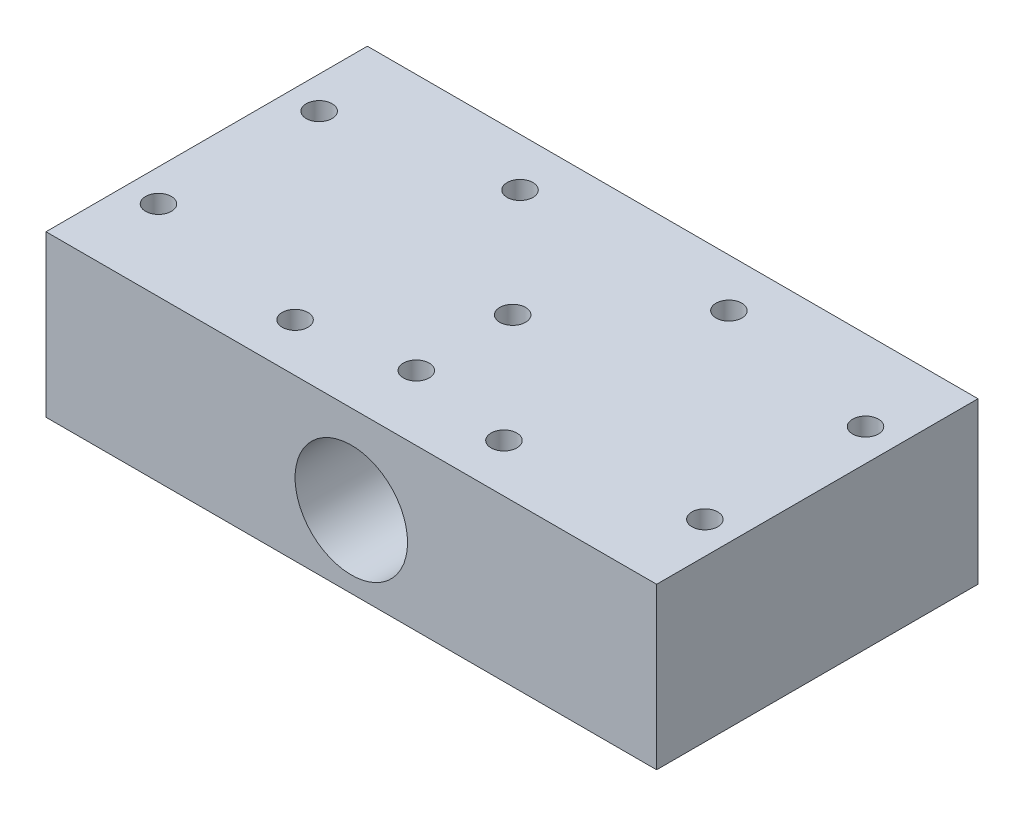
ISO-10303-21;
HEADER;
FILE_DESCRIPTION(('STEP AP214'),'2;1');
FILE_NAME('part.step','',(''),(''),'','','');
FILE_SCHEMA(('AUTOMOTIVE_DESIGN { 1 0 10303 214 1 1 1 1 }'));
ENDSEC;
DATA;
#1=APPLICATION_CONTEXT('core data for automotive mechanical design processes');
#2=APPLICATION_PROTOCOL_DEFINITION('international standard','automotive_design',2000,#1);
#3=PRODUCT_CONTEXT('',#1,'mechanical');
#4=PRODUCT('Part','Part','',(#3));
#5=PRODUCT_RELATED_PRODUCT_CATEGORY('part','',(#4));
#6=PRODUCT_DEFINITION_FORMATION('','',#4);
#7=PRODUCT_DEFINITION_CONTEXT('part definition',#1,'design');
#8=PRODUCT_DEFINITION('design','',#6,#7);
#9=PRODUCT_DEFINITION_SHAPE('','',#8);
#10=(LENGTH_UNIT() NAMED_UNIT(*) SI_UNIT(.MILLI.,.METRE.));
#11=(NAMED_UNIT(*) PLANE_ANGLE_UNIT() SI_UNIT($,.RADIAN.));
#12=(NAMED_UNIT(*) SI_UNIT($,.STERADIAN.) SOLID_ANGLE_UNIT());
#13=UNCERTAINTY_MEASURE_WITH_UNIT(LENGTH_MEASURE(1.E-05),#10,'distance_accuracy_value','');
#14=(GEOMETRIC_REPRESENTATION_CONTEXT(3) GLOBAL_UNCERTAINTY_ASSIGNED_CONTEXT((#13)) GLOBAL_UNIT_ASSIGNED_CONTEXT((#10,
#11,#12)) REPRESENTATION_CONTEXT('',''));
#15=CARTESIAN_POINT('',(0.,0.,0.));
#16=DIRECTION('',(0.,0.,1.));
#17=DIRECTION('',(1.,0.,0.));
#18=AXIS2_PLACEMENT_3D('',#15,#16,#17);
#19=CARTESIAN_POINT('',(-120.65,15.875,-31.75));
#20=DIRECTION('',(0.,0.,-1.));
#21=DIRECTION('',(-1.,0.,0.));
#22=AXIS2_PLACEMENT_3D('',#19,#20,#21);
#23=PLANE('',#22);
#24=CARTESIAN_POINT('',(-60.325,-1.58750000000001,-31.75));
#25=DIRECTION('',(0.,0.,-1.));
#26=DIRECTION('',(-1.,0.,0.));
#27=AXIS2_PLACEMENT_3D('',#24,#25,#26);
#28=CIRCLE('',#27,11.1125);
#29=CARTESIAN_POINT('',(-71.4375,-1.58750000000001,-31.75));
#30=VERTEX_POINT('',#29);
#31=EDGE_CURVE('E226',#30,#30,#28,.T.);
#32=ORIENTED_EDGE('',*,*,#31,.F.);
#33=EDGE_LOOP('',(#32));
#34=FACE_BOUND('',#33,.T.);
#35=DIRECTION('',(0.,1.,0.));
#36=VECTOR('',#35,1.);
#37=CARTESIAN_POINT('',(0.,15.875,-31.75));
#38=LINE('',#37,#36);
#39=CARTESIAN_POINT('',(0.,-15.875,-31.75));
#40=VERTEX_POINT('',#39);
#41=CARTESIAN_POINT('',(0.,15.875,-31.75));
#42=VERTEX_POINT('',#41);
#43=EDGE_CURVE('E228',#40,#42,#38,.T.);
#44=ORIENTED_EDGE('',*,*,#43,.F.);
#45=DIRECTION('',(1.,0.,0.));
#46=VECTOR('',#45,1.);
#47=CARTESIAN_POINT('',(-120.65,-15.875,-31.75));
#48=LINE('',#47,#46);
#49=CARTESIAN_POINT('',(-120.65,-15.875,-31.75));
#50=VERTEX_POINT('',#49);
#51=EDGE_CURVE('E11',#50,#40,#48,.T.);
#52=ORIENTED_EDGE('',*,*,#51,.F.);
#53=DIRECTION('',(0.,1.,0.));
#54=VECTOR('',#53,1.);
#55=CARTESIAN_POINT('',(-120.65,15.875,-31.75));
#56=LINE('',#55,#54);
#57=CARTESIAN_POINT('',(-120.65,15.875,-31.75));
#58=VERTEX_POINT('',#57);
#59=EDGE_CURVE('E237',#50,#58,#56,.T.);
#60=ORIENTED_EDGE('',*,*,#59,.T.);
#61=DIRECTION('',(1.,0.,0.));
#62=VECTOR('',#61,1.);
#63=CARTESIAN_POINT('',(-120.65,15.875,-31.75));
#64=LINE('',#63,#62);
#65=EDGE_CURVE('E40',#58,#42,#64,.T.);
#66=ORIENTED_EDGE('',*,*,#65,.T.);
#67=EDGE_LOOP('',(#44,#52,#60,#66));
#68=FACE_BOUND('',#67,.T.);
#69=ADVANCED_FACE('F37',(#34,#68),#23,.T.);
#70=CARTESIAN_POINT('',(-120.65,-15.875,31.75));
#71=DIRECTION('',(0.,-1.,0.));
#72=DIRECTION('',(0.,0.,-1.));
#73=AXIS2_PLACEMENT_3D('',#70,#71,#72);
#74=PLANE('',#73);
#75=CARTESIAN_POINT('',(-114.3,-15.875,-15.875));
#76=DIRECTION('',(0.,1.,0.));
#77=DIRECTION('',(0.,0.,1.));
#78=AXIS2_PLACEMENT_3D('',#75,#76,#77);
#79=CIRCLE('',#78,2.55269999999999);
#80=CARTESIAN_POINT('',(-114.3,-15.875,-13.3223));
#81=VERTEX_POINT('',#80);
#82=EDGE_CURVE('E131',#81,#81,#79,.T.);
#83=ORIENTED_EDGE('',*,*,#82,.T.);
#84=EDGE_LOOP('',(#83));
#85=FACE_BOUND('',#84,.T.);
#86=CARTESIAN_POINT('',(-114.3,-15.875,15.875));
#87=DIRECTION('',(0.,1.,0.));
#88=DIRECTION('',(0.,0.,1.));
#89=AXIS2_PLACEMENT_3D('',#86,#87,#88);
#90=CIRCLE('',#89,2.55269999999999);
#91=CARTESIAN_POINT('',(-114.3,-15.875,18.4277));
#92=VERTEX_POINT('',#91);
#93=EDGE_CURVE('E137',#92,#92,#90,.T.);
#94=ORIENTED_EDGE('',*,*,#93,.T.);
#95=EDGE_LOOP('',(#94));
#96=FACE_BOUND('',#95,.T.);
#97=CARTESIAN_POINT('',(-6.34999999999999,-15.875,15.875));
#98=DIRECTION('',(0.,1.,0.));
#99=DIRECTION('',(0.,0.,1.));
#100=AXIS2_PLACEMENT_3D('',#97,#98,#99);
#101=CIRCLE('',#100,2.55269999999999);
#102=CARTESIAN_POINT('',(-6.34999999999999,-15.875,18.4277));
#103=VERTEX_POINT('',#102);
#104=EDGE_CURVE('E143',#103,#103,#101,.T.);
#105=ORIENTED_EDGE('',*,*,#104,.T.);
#106=EDGE_LOOP('',(#105));
#107=FACE_BOUND('',#106,.T.);
#108=CARTESIAN_POINT('',(-6.35,-15.875,-15.875));
#109=DIRECTION('',(0.,1.,0.));
#110=DIRECTION('',(0.,0.,1.));
#111=AXIS2_PLACEMENT_3D('',#108,#109,#110);
#112=CIRCLE('',#111,2.55269999999999);
#113=CARTESIAN_POINT('',(-6.35,-15.875,-13.3223));
#114=VERTEX_POINT('',#113);
#115=EDGE_CURVE('E149',#114,#114,#112,.T.);
#116=ORIENTED_EDGE('',*,*,#115,.T.);
#117=EDGE_LOOP('',(#116));
#118=FACE_BOUND('',#117,.T.);
#119=DIRECTION('',(0.,0.,-1.));
#120=VECTOR('',#119,1.);
#121=CARTESIAN_POINT('',(0.,-15.875,31.75));
#122=LINE('',#121,#120);
#123=CARTESIAN_POINT('',(0.,-15.875,31.75));
#124=VERTEX_POINT('',#123);
#125=EDGE_CURVE('E234',#124,#40,#122,.T.);
#126=ORIENTED_EDGE('',*,*,#125,.F.);
#127=DIRECTION('',(1.,0.,0.));
#128=VECTOR('',#127,1.);
#129=CARTESIAN_POINT('',(-120.65,-15.875,31.75));
#130=LINE('',#129,#128);
#131=CARTESIAN_POINT('',(-120.65,-15.875,31.75));
#132=VERTEX_POINT('',#131);
#133=EDGE_CURVE('E46',#132,#124,#130,.T.);
#134=ORIENTED_EDGE('',*,*,#133,.F.);
#135=DIRECTION('',(0.,0.,-1.));
#136=VECTOR('',#135,1.);
#137=CARTESIAN_POINT('',(-120.65,-15.875,31.75));
#138=LINE('',#137,#136);
#139=EDGE_CURVE('E245',#132,#50,#138,.T.);
#140=ORIENTED_EDGE('',*,*,#139,.T.);
#141=ORIENTED_EDGE('',*,*,#51,.T.);
#142=EDGE_LOOP('',(#126,#134,#140,#141));
#143=FACE_BOUND('',#142,.T.);
#144=ADVANCED_FACE('F216',(#85,#96,#107,#118,#143),#74,.T.);
#145=CARTESIAN_POINT('',(-120.65,15.875,31.75));
#146=DIRECTION('',(0.,0.,1.));
#147=DIRECTION('',(0.,-1.,0.));
#148=AXIS2_PLACEMENT_3D('',#145,#146,#147);
#149=PLANE('',#148);
#150=CARTESIAN_POINT('',(-60.325,-1.58750000000001,31.75));
#151=DIRECTION('',(0.,0.,1.));
#152=DIRECTION('',(1.,0.,0.));
#153=AXIS2_PLACEMENT_3D('',#150,#151,#152);
#154=CIRCLE('',#153,11.1125);
#155=CARTESIAN_POINT('',(-49.2125,-1.58750000000001,31.75));
#156=VERTEX_POINT('',#155);
#157=EDGE_CURVE('E279',#156,#156,#154,.T.);
#158=ORIENTED_EDGE('',*,*,#157,.F.);
#159=EDGE_LOOP('',(#158));
#160=FACE_BOUND('',#159,.T.);
#161=DIRECTION('',(0.,-1.,0.));
#162=VECTOR('',#161,1.);
#163=CARTESIAN_POINT('',(0.,15.875,31.75));
#164=LINE('',#163,#162);
#165=CARTESIAN_POINT('',(0.,15.875,31.75));
#166=VERTEX_POINT('',#165);
#167=EDGE_CURVE('E236',#166,#124,#164,.T.);
#168=ORIENTED_EDGE('',*,*,#167,.F.);
#169=DIRECTION('',(1.,0.,0.));
#170=VECTOR('',#169,1.);
#171=CARTESIAN_POINT('',(-120.65,15.875,31.75));
#172=LINE('',#171,#170);
#173=CARTESIAN_POINT('',(-120.65,15.875,31.75));
#174=VERTEX_POINT('',#173);
#175=EDGE_CURVE('E244',#174,#166,#172,.T.);
#176=ORIENTED_EDGE('',*,*,#175,.F.);
#177=DIRECTION('',(0.,-1.,0.));
#178=VECTOR('',#177,1.);
#179=CARTESIAN_POINT('',(-120.65,15.875,31.75));
#180=LINE('',#179,#178);
#181=EDGE_CURVE('E246',#174,#132,#180,.T.);
#182=ORIENTED_EDGE('',*,*,#181,.T.);
#183=ORIENTED_EDGE('',*,*,#133,.T.);
#184=EDGE_LOOP('',(#168,#176,#182,#183));
#185=FACE_BOUND('',#184,.T.);
#186=ADVANCED_FACE('F221',(#160,#185),#149,.T.);
#187=CARTESIAN_POINT('',(-120.65,15.875,31.75));
#188=DIRECTION('',(0.,1.,0.));
#189=DIRECTION('',(0.,0.,1.));
#190=AXIS2_PLACEMENT_3D('',#187,#188,#189);
#191=PLANE('',#190);
#192=CARTESIAN_POINT('',(-80.9625,15.875,-22.225));
#193=DIRECTION('',(0.,1.,0.));
#194=DIRECTION('',(0.,0.,1.));
#195=AXIS2_PLACEMENT_3D('',#192,#193,#194);
#196=CIRCLE('',#195,2.55269999999999);
#197=CARTESIAN_POINT('',(-80.9625,15.875,-19.6723));
#198=VERTEX_POINT('',#197);
#199=EDGE_CURVE('E106',#198,#198,#196,.T.);
#200=ORIENTED_EDGE('',*,*,#199,.F.);
#201=EDGE_LOOP('',(#200));
#202=FACE_BOUND('',#201,.T.);
#203=CARTESIAN_POINT('',(-39.6875,15.875,22.225));
#204=DIRECTION('',(0.,1.,0.));
#205=DIRECTION('',(0.,0.,1.));
#206=AXIS2_PLACEMENT_3D('',#203,#204,#205);
#207=CIRCLE('',#206,2.55269999999999);
#208=CARTESIAN_POINT('',(-39.6875,15.875,24.7777));
#209=VERTEX_POINT('',#208);
#210=EDGE_CURVE('E105',#209,#209,#207,.T.);
#211=ORIENTED_EDGE('',*,*,#210,.F.);
#212=EDGE_LOOP('',(#211));
#213=FACE_BOUND('',#212,.T.);
#214=CARTESIAN_POINT('',(-80.9625,15.875,22.225));
#215=DIRECTION('',(0.,1.,0.));
#216=DIRECTION('',(0.,0.,1.));
#217=AXIS2_PLACEMENT_3D('',#214,#215,#216);
#218=CIRCLE('',#217,2.55269999999999);
#219=CARTESIAN_POINT('',(-80.9625,15.875,24.7777));
#220=VERTEX_POINT('',#219);
#221=EDGE_CURVE('E116',#220,#220,#218,.T.);
#222=ORIENTED_EDGE('',*,*,#221,.F.);
#223=EDGE_LOOP('',(#222));
#224=FACE_BOUND('',#223,.T.);
#225=CARTESIAN_POINT('',(-39.6875,15.875,-22.225));
#226=DIRECTION('',(0.,1.,0.));
#227=DIRECTION('',(0.,0.,1.));
#228=AXIS2_PLACEMENT_3D('',#225,#226,#227);
#229=CIRCLE('',#228,2.55269999999999);
#230=CARTESIAN_POINT('',(-39.6875,15.875,-19.6723));
#231=VERTEX_POINT('',#230);
#232=EDGE_CURVE('E122',#231,#231,#229,.T.);
#233=ORIENTED_EDGE('',*,*,#232,.F.);
#234=EDGE_LOOP('',(#233));
#235=FACE_BOUND('',#234,.T.);
#236=CARTESIAN_POINT('',(-114.3,15.875,-15.875));
#237=DIRECTION('',(0.,1.,0.));
#238=DIRECTION('',(0.,0.,1.));
#239=AXIS2_PLACEMENT_3D('',#236,#237,#238);
#240=CIRCLE('',#239,2.55269999999999);
#241=CARTESIAN_POINT('',(-114.3,15.875,-13.3223));
#242=VERTEX_POINT('',#241);
#243=EDGE_CURVE('E128',#242,#242,#240,.T.);
#244=ORIENTED_EDGE('',*,*,#243,.F.);
#245=EDGE_LOOP('',(#244));
#246=FACE_BOUND('',#245,.T.);
#247=CARTESIAN_POINT('',(-114.3,15.875,15.875));
#248=DIRECTION('',(0.,1.,0.));
#249=DIRECTION('',(0.,0.,1.));
#250=AXIS2_PLACEMENT_3D('',#247,#248,#249);
#251=CIRCLE('',#250,2.55269999999999);
#252=CARTESIAN_POINT('',(-114.3,15.875,18.4277));
#253=VERTEX_POINT('',#252);
#254=EDGE_CURVE('E134',#253,#253,#251,.T.);
#255=ORIENTED_EDGE('',*,*,#254,.F.);
#256=EDGE_LOOP('',(#255));
#257=FACE_BOUND('',#256,.T.);
#258=CARTESIAN_POINT('',(-6.34999999999999,15.875,15.875));
#259=DIRECTION('',(0.,1.,0.));
#260=DIRECTION('',(0.,0.,1.));
#261=AXIS2_PLACEMENT_3D('',#258,#259,#260);
#262=CIRCLE('',#261,2.55269999999999);
#263=CARTESIAN_POINT('',(-6.34999999999999,15.875,18.4277));
#264=VERTEX_POINT('',#263);
#265=EDGE_CURVE('E140',#264,#264,#262,.T.);
#266=ORIENTED_EDGE('',*,*,#265,.F.);
#267=EDGE_LOOP('',(#266));
#268=FACE_BOUND('',#267,.T.);
#269=CARTESIAN_POINT('',(-6.35,15.875,-15.875));
#270=DIRECTION('',(0.,1.,0.));
#271=DIRECTION('',(0.,0.,1.));
#272=AXIS2_PLACEMENT_3D('',#269,#270,#271);
#273=CIRCLE('',#272,2.55269999999999);
#274=CARTESIAN_POINT('',(-6.35,15.875,-13.3223));
#275=VERTEX_POINT('',#274);
#276=EDGE_CURVE('E146',#275,#275,#273,.T.);
#277=ORIENTED_EDGE('',*,*,#276,.F.);
#278=EDGE_LOOP('',(#277));
#279=FACE_BOUND('',#278,.T.);
#280=CARTESIAN_POINT('',(-60.325,15.875,-0.135161527175631));
#281=DIRECTION('',(0.,1.,0.));
#282=DIRECTION('',(0.,0.,1.));
#283=AXIS2_PLACEMENT_3D('',#280,#281,#282);
#284=CIRCLE('',#283,2.55269999999999);
#285=CARTESIAN_POINT('',(-60.325,15.875,2.41753847282436));
#286=VERTEX_POINT('',#285);
#287=EDGE_CURVE('E152',#286,#286,#284,.T.);
#288=ORIENTED_EDGE('',*,*,#287,.F.);
#289=EDGE_LOOP('',(#288));
#290=FACE_BOUND('',#289,.T.);
#291=CARTESIAN_POINT('',(-60.325,15.875,18.9148384728244));
#292=DIRECTION('',(0.,1.,0.));
#293=DIRECTION('',(0.,0.,1.));
#294=AXIS2_PLACEMENT_3D('',#291,#292,#293);
#295=CIRCLE('',#294,2.55269999999998);
#296=CARTESIAN_POINT('',(-60.325,15.875,21.4675384728244));
#297=VERTEX_POINT('',#296);
#298=EDGE_CURVE('E162',#297,#297,#295,.T.);
#299=ORIENTED_EDGE('',*,*,#298,.F.);
#300=EDGE_LOOP('',(#299));
#301=FACE_BOUND('',#300,.T.);
#302=DIRECTION('',(0.,0.,1.));
#303=VECTOR('',#302,1.);
#304=CARTESIAN_POINT('',(0.,15.875,31.75));
#305=LINE('',#304,#303);
#306=EDGE_CURVE('E232',#42,#166,#305,.T.);
#307=ORIENTED_EDGE('',*,*,#306,.F.);
#308=ORIENTED_EDGE('',*,*,#65,.F.);
#309=DIRECTION('',(0.,0.,1.));
#310=VECTOR('',#309,1.);
#311=CARTESIAN_POINT('',(-120.65,15.875,31.75));
#312=LINE('',#311,#310);
#313=EDGE_CURVE('E239',#58,#174,#312,.T.);
#314=ORIENTED_EDGE('',*,*,#313,.T.);
#315=ORIENTED_EDGE('',*,*,#175,.T.);
#316=EDGE_LOOP('',(#307,#308,#314,#315));
#317=FACE_BOUND('',#316,.T.);
#318=ADVANCED_FACE('F251',(#202,#213,#224,#235,#246,#257,#268,#279,#290,#301,#317),#191,.T.);
#319=CARTESIAN_POINT('',(-120.65,0.,0.));
#320=DIRECTION('',(1.,0.,0.));
#321=DIRECTION('',(0.,0.,-1.));
#322=AXIS2_PLACEMENT_3D('',#319,#320,#321);
#323=PLANE('',#322);
#324=ORIENTED_EDGE('',*,*,#59,.F.);
#325=ORIENTED_EDGE('',*,*,#139,.F.);
#326=ORIENTED_EDGE('',*,*,#181,.F.);
#327=ORIENTED_EDGE('',*,*,#313,.F.);
#328=EDGE_LOOP('',(#324,#325,#326,#327));
#329=FACE_BOUND('',#328,.T.);
#330=ADVANCED_FACE('F253',(#329),#323,.F.);
#331=CARTESIAN_POINT('',(0.,0.,0.));
#332=DIRECTION('',(1.,0.,0.));
#333=DIRECTION('',(0.,0.,-1.));
#334=AXIS2_PLACEMENT_3D('',#331,#332,#333);
#335=PLANE('',#334);
#336=ORIENTED_EDGE('',*,*,#43,.T.);
#337=ORIENTED_EDGE('',*,*,#306,.T.);
#338=ORIENTED_EDGE('',*,*,#167,.T.);
#339=ORIENTED_EDGE('',*,*,#125,.T.);
#340=EDGE_LOOP('',(#336,#337,#338,#339));
#341=FACE_BOUND('',#340,.T.);
#342=ADVANCED_FACE('F235',(#341),#335,.T.);
#343=CARTESIAN_POINT('',(-60.325,-1.58750000000001,31.75));
#344=DIRECTION('',(0.,0.,1.));
#345=DIRECTION('',(1.,0.,0.));
#346=AXIS2_PLACEMENT_3D('',#343,#344,#345);
#347=CYLINDRICAL_SURFACE('',#346,11.1125);
#348=CARTESIAN_POINT('',(-60.325,9.525,2.41753847282436));
#349=CARTESIAN_POINT('',(-60.1836030161131,9.52499743320183,2.41753390891614));
#350=CARTESIAN_POINT('',(-60.0421523668807,9.52227402163549,2.40575063493719));
#351=CARTESIAN_POINT('',(-59.7632811580994,9.51167310615282,2.35898506498536));
#352=CARTESIAN_POINT('',(-59.6258633405474,9.50379217666007,2.3239873499824));
#353=CARTESIAN_POINT('',(-59.3591272877043,9.48375209951869,2.23195657747022));
#354=CARTESIAN_POINT('',(-59.2298003401951,9.47159765034338,2.17494771314553));
#355=CARTESIAN_POINT('',(-58.9825493235107,9.44431645112713,2.04059258284332));
#356=CARTESIAN_POINT('',(-58.864625193275,9.42918971700366,1.96324642577729));
#357=CARTESIAN_POINT('',(-58.6414498665475,9.39731851811461,1.78897324868507));
#358=CARTESIAN_POINT('',(-58.5364279478591,9.38055229677803,1.69175657064048));
#359=CARTESIAN_POINT('',(-58.3440279038719,9.34744206303304,1.48112325528711));
#360=CARTESIAN_POINT('',(-58.2566514847247,9.3310980915853,1.36770505325393));
#361=CARTESIAN_POINT('',(-58.1009887590705,9.30046684205347,1.12616433399517));
#362=CARTESIAN_POINT('',(-58.032950708317,9.28620736039381,0.997877984749552));
#363=CARTESIAN_POINT('',(-57.9194898412946,9.26167366945769,0.731309994124112));
#364=CARTESIAN_POINT('',(-57.8740640192741,9.2513989305457,0.593029684000828));
#365=CARTESIAN_POINT('',(-57.8078831019162,9.23622038339159,0.312898050964632));
#366=CARTESIAN_POINT('',(-57.7867198813639,9.23122783682414,0.171148061367231));
#367=CARTESIAN_POINT('',(-57.768395113778,9.22691275314558,-0.113971575573388));
#368=CARTESIAN_POINT('',(-57.7712302998989,9.22758944429459,-0.257340999813378));
#369=CARTESIAN_POINT('',(-57.80049438228,9.23445622742297,-0.53856464284996));
#370=CARTESIAN_POINT('',(-57.8264451312256,9.24053457969065,-0.676471763653429));
#371=CARTESIAN_POINT('',(-57.900444406596,9.2573426730924,-0.945921014361591));
#372=CARTESIAN_POINT('',(-57.9484942865687,9.26807269913416,-1.07746275384803));
#373=CARTESIAN_POINT('',(-58.0657561351033,9.29308268281673,-1.33177042523305));
#374=CARTESIAN_POINT('',(-58.1351484513697,9.30739269192919,-1.45445011956088));
#375=CARTESIAN_POINT('',(-58.292998815581,9.33793234009429,-1.68659909071081));
#376=CARTESIAN_POINT('',(-58.3814597140324,9.35416226598582,-1.7960663886299));
#377=CARTESIAN_POINT('',(-58.5774489696264,9.38718949137806,-2.00143190335135));
#378=CARTESIAN_POINT('',(-58.6853829081997,9.40399107479656,-2.09694278469563));
#379=CARTESIAN_POINT('',(-58.9159305808586,9.43591604655302,-2.26857498029026));
#380=CARTESIAN_POINT('',(-59.0385446366549,9.45103939809898,-2.34469586949989));
#381=CARTESIAN_POINT('',(-59.2954715694381,9.4779612367422,-2.47549842882027));
#382=CARTESIAN_POINT('',(-59.4298133145012,9.48975119827245,-2.53012526230595));
#383=CARTESIAN_POINT('',(-59.706101531606,9.50861505852926,-2.61591879609215));
#384=CARTESIAN_POINT('',(-59.8480467771373,9.51568971541507,-2.64708926797262));
#385=CARTESIAN_POINT('',(-60.1321939374019,9.52421648014323,-2.68451243364597));
#386=CARTESIAN_POINT('',(-60.2743227607709,9.525787828652,-2.6912936601174));
#387=CARTESIAN_POINT('',(-60.5576827903625,9.52346691655541,-2.68118414882392));
#388=CARTESIAN_POINT('',(-60.6989140632958,9.51957506688891,-2.66429519151784));
#389=CARTESIAN_POINT('',(-60.9746899407241,9.50684070592155,-2.6077622498531));
#390=CARTESIAN_POINT('',(-61.1092952203391,9.4980593569585,-2.56839924002182));
#391=CARTESIAN_POINT('',(-61.3699904345264,9.47653068437118,-2.46835047943234));
#392=CARTESIAN_POINT('',(-61.4960795930954,9.46378299991955,-2.40766278865006));
#393=CARTESIAN_POINT('',(-61.7383212012406,9.43544408847207,-2.26561227302192));
#394=CARTESIAN_POINT('',(-61.8542895231755,9.41981188178931,-2.18394381398263));
#395=CARTESIAN_POINT('',(-62.071064640665,9.38751465822437,-2.00264841689266));
#396=CARTESIAN_POINT('',(-62.1718692458485,9.37084949262317,-1.90301888895941));
#397=CARTESIAN_POINT('',(-62.3575754154166,9.33794676346516,-1.68619350924275));
#398=CARTESIAN_POINT('',(-62.4421092408723,9.32172493400493,-1.56867984560511));
#399=CARTESIAN_POINT('',(-62.5902468924924,9.29193220068738,-1.32081557433808));
#400=CARTESIAN_POINT('',(-62.6538516478684,9.27836117915001,-1.19046553695365));
#401=CARTESIAN_POINT('',(-62.7578765425507,9.25554412516852,-0.921339140737835));
#402=CARTESIAN_POINT('',(-62.7984311243702,9.24627307232048,-0.78261697577913));
#403=CARTESIAN_POINT('',(-62.8555873127508,9.23306655173118,-0.500083796566928));
#404=CARTESIAN_POINT('',(-62.8721932099815,9.22913012824016,-0.35627369860384));
#405=CARTESIAN_POINT('',(-62.8807836350592,9.22710313622685,-0.0713655784080183));
#406=CARTESIAN_POINT('',(-62.8733526739332,9.2288737834957,0.0697141400236173));
#407=CARTESIAN_POINT('',(-62.8353974982893,9.23774518911233,0.348552563807455));
#408=CARTESIAN_POINT('',(-62.8048736161678,9.24484587074032,0.486311316931735));
#409=CARTESIAN_POINT('',(-62.7218943427457,9.26350625614538,0.754075312077417));
#410=CARTESIAN_POINT('',(-62.6695323331879,9.27504695790855,0.884110905932756));
#411=CARTESIAN_POINT('',(-62.544440495804,9.30129270273671,1.13363535194679));
#412=CARTESIAN_POINT('',(-62.4717082993604,9.31599811374369,1.25312297547562));
#413=CARTESIAN_POINT('',(-62.3060379612459,9.34732458660655,1.4810222298854));
#414=CARTESIAN_POINT('',(-62.2126868833472,9.36398094408373,1.58912888319103));
#415=CARTESIAN_POINT('',(-62.0092549300149,9.39710477493986,1.78833380769225));
#416=CARTESIAN_POINT('',(-61.8991701657069,9.41357220345288,1.87942811425771));
#417=CARTESIAN_POINT('',(-61.6634524909408,9.44474930683551,2.04330771367942));
#418=CARTESIAN_POINT('',(-61.5376156086198,9.45942972937864,2.1158055380505));
#419=CARTESIAN_POINT('',(-61.2752251857663,9.48508077171662,2.23850424738142));
#420=CARTESIAN_POINT('',(-61.1386803032818,9.49605435137143,2.28872293199777));
#421=CARTESIAN_POINT('',(-60.8892651012963,9.51120877334188,2.35698469518584));
#422=CARTESIAN_POINT('',(-60.7776941315176,9.51634730157453,2.37964716177968));
#423=CARTESIAN_POINT('',(-60.552426938195,9.52324385673681,2.40992548345616));
#424=CARTESIAN_POINT('',(-60.4387308287109,9.5250020645708,2.41754214374471));
#425=CARTESIAN_POINT('',(-60.325,9.525,2.41753847282436));
#426=B_SPLINE_CURVE_WITH_KNOTS('',3,(#348,#349,#350,#351,#352,#353,#354,#355,#356,#357,#358,
#359,#360,#361,#362,#363,#364,#365,#366,#367,#368,#369,#370,#371,#372,#373,#374,#375,#376,#377,
#378,#379,#380,#381,#382,#383,#384,#385,#386,#387,#388,#389,#390,#391,#392,#393,#394,#395,#396,
#397,#398,#399,#400,#401,#402,#403,#404,#405,#406,#407,#408,#409,#410,#411,#412,#413,#414,#415,
#416,#417,#418,#419,#420,#421,#422,#423,#424,#425),.UNSPECIFIED.,.T.,.F.,(4,2,2,2,2,2,2,2,2,2,2,
2,2,2,2,2,2,2,2,2,2,2,2,2,2,2,2,2,2,2,2,2,2,2,2,2,2,2,4),(0.,0.423774493378559,
0.847830739970784,1.27142221306672,1.69501141776645,2.12528317574874,2.55559651700898,
2.99120733527721,3.42676023409687,3.85487386840064,4.2829292255579,4.70233068759837,
5.12175784094858,5.54483141941706,5.96796828582672,6.40122950035739,6.83450021142713,
7.26886924458624,7.70316842003189,8.12799731890799,8.55279426409171,8.97239311136645,
9.39203014175462,9.81816596051272,10.2443632748177,10.6792840916489,11.1141855962021,
11.5465237531631,11.9787844423722,12.4006134783276,12.8224364426482,13.2424738545288,
13.6625601280783,14.0919775032117,14.521494827071,14.9572982433887,15.3927528498978,
15.7336286063474,16.0744861196662),.UNSPECIFIED.);
#427=CARTESIAN_POINT('',(-60.325,9.525,2.41753847282436));
#428=VERTEX_POINT('',#427);
#429=EDGE_CURVE('E155',#428,#428,#426,.T.);
#430=ORIENTED_EDGE('',*,*,#429,.T.);
#431=EDGE_LOOP('',(#430));
#432=FACE_BOUND('',#431,.T.);
#433=CARTESIAN_POINT('',(-60.325,9.525,21.4675384728244));
#434=CARTESIAN_POINT('',(-60.1836030161131,9.52499743320183,21.4675339089161));
#435=CARTESIAN_POINT('',(-60.0421523668807,9.52227402163549,21.4557506349372));
#436=CARTESIAN_POINT('',(-59.7632811580994,9.51167310615282,21.4089850649854));
#437=CARTESIAN_POINT('',(-59.6258633405474,9.50379217666007,21.3739873499824));
#438=CARTESIAN_POINT('',(-59.3591272877043,9.48375209951869,21.2819565774702));
#439=CARTESIAN_POINT('',(-59.2298003401951,9.47159765034338,21.2249477131455));
#440=CARTESIAN_POINT('',(-58.9825493235107,9.44431645112713,21.0905925828433));
#441=CARTESIAN_POINT('',(-58.864625193275,9.42918971700366,21.0132464257773));
#442=CARTESIAN_POINT('',(-58.6414498665475,9.39731851811461,20.8389732486851));
#443=CARTESIAN_POINT('',(-58.5364279478591,9.38055229677803,20.7417565706405));
#444=CARTESIAN_POINT('',(-58.3440279038719,9.34744206303305,20.5311232552871));
#445=CARTESIAN_POINT('',(-58.2566514847247,9.3310980915853,20.4177050532539));
#446=CARTESIAN_POINT('',(-58.1009887590705,9.30046684205347,20.1761643339952));
#447=CARTESIAN_POINT('',(-58.032950708317,9.28620736039381,20.0478779847496));
#448=CARTESIAN_POINT('',(-57.9194898412946,9.26167366945769,19.7813099941241));
#449=CARTESIAN_POINT('',(-57.8740640192741,9.2513989305457,19.6430296840008));
#450=CARTESIAN_POINT('',(-57.8078831019163,9.23622038339159,19.3628980509646));
#451=CARTESIAN_POINT('',(-57.7867198813639,9.23122783682414,19.2211480613672));
#452=CARTESIAN_POINT('',(-57.768395113778,9.22691275314559,18.9360284244266));
#453=CARTESIAN_POINT('',(-57.7712302998989,9.2275894442946,18.7926590001866));
#454=CARTESIAN_POINT('',(-57.80049438228,9.23445622742297,18.51143535715));
#455=CARTESIAN_POINT('',(-57.8264451312256,9.24053457969066,18.3735282363466));
#456=CARTESIAN_POINT('',(-57.900444406596,9.2573426730924,18.1040789856384));
#457=CARTESIAN_POINT('',(-57.9484942865687,9.26807269913416,17.972537246152));
#458=CARTESIAN_POINT('',(-58.0657561351033,9.29308268281673,17.718229574767));
#459=CARTESIAN_POINT('',(-58.1351484513697,9.30739269192919,17.5955498804391));
#460=CARTESIAN_POINT('',(-58.292998815581,9.33793234009429,17.3634009092892));
#461=CARTESIAN_POINT('',(-58.3814597140324,9.35416226598582,17.2539336113701));
#462=CARTESIAN_POINT('',(-58.5774489696264,9.38718949137806,17.0485680966487));
#463=CARTESIAN_POINT('',(-58.6853829081997,9.40399107479656,16.9530572153044));
#464=CARTESIAN_POINT('',(-58.9159305808586,9.43591604655302,16.7814250197097));
#465=CARTESIAN_POINT('',(-59.0385446366549,9.45103939809898,16.7053041305001));
#466=CARTESIAN_POINT('',(-59.2954715694381,9.4779612367422,16.5745015711797));
#467=CARTESIAN_POINT('',(-59.4298133145012,9.48975119827245,16.5198747376941));
#468=CARTESIAN_POINT('',(-59.706101531606,9.50861505852926,16.4340812039079));
#469=CARTESIAN_POINT('',(-59.8480467771373,9.51568971541507,16.4029107320274));
#470=CARTESIAN_POINT('',(-60.1321939374019,9.52421648014323,16.365487566354));
#471=CARTESIAN_POINT('',(-60.2743227607709,9.525787828652,16.3587063398826));
#472=CARTESIAN_POINT('',(-60.5576827903625,9.52346691655541,16.3688158511761));
#473=CARTESIAN_POINT('',(-60.6989140632958,9.51957506688891,16.3857048084822));
#474=CARTESIAN_POINT('',(-60.9746899407241,9.50684070592155,16.4422377501469));
#475=CARTESIAN_POINT('',(-61.1092952203391,9.4980593569585,16.4816007599782));
#476=CARTESIAN_POINT('',(-61.3699904345264,9.47653068437118,16.5816495205677));
#477=CARTESIAN_POINT('',(-61.4960795930954,9.46378299991955,16.6423372113499));
#478=CARTESIAN_POINT('',(-61.7383212012406,9.43544408847207,16.7843877269781));
#479=CARTESIAN_POINT('',(-61.8542895231755,9.41981188178931,16.8660561860174));
#480=CARTESIAN_POINT('',(-62.071064640665,9.38751465822437,17.0473515831073));
#481=CARTESIAN_POINT('',(-62.1718692458485,9.37084949262317,17.1469811110406));
#482=CARTESIAN_POINT('',(-62.3575754154166,9.33794676346516,17.3638064907572));
#483=CARTESIAN_POINT('',(-62.4421092408723,9.32172493400493,17.4813201543949));
#484=CARTESIAN_POINT('',(-62.5902468924924,9.29193220068738,17.7291844256619));
#485=CARTESIAN_POINT('',(-62.6538516478684,9.27836117915001,17.8595344630463));
#486=CARTESIAN_POINT('',(-62.7578765425507,9.25554412516852,18.1286608592622));
#487=CARTESIAN_POINT('',(-62.7984311243702,9.24627307232048,18.2673830242209));
#488=CARTESIAN_POINT('',(-62.8555873127508,9.23306655173118,18.5499162034331));
#489=CARTESIAN_POINT('',(-62.8721932099815,9.22913012824016,18.6937263013962));
#490=CARTESIAN_POINT('',(-62.8807836350592,9.22710313622685,18.978634421592));
#491=CARTESIAN_POINT('',(-62.8733526739332,9.2288737834957,19.1197141400236));
#492=CARTESIAN_POINT('',(-62.8353974982893,9.23774518911233,19.3985525638075));
#493=CARTESIAN_POINT('',(-62.8048736161678,9.24484587074032,19.5363113169317));
#494=CARTESIAN_POINT('',(-62.7218943427457,9.26350625614537,19.8040753120774));
#495=CARTESIAN_POINT('',(-62.6695323331879,9.27504695790855,19.9341109059328));
#496=CARTESIAN_POINT('',(-62.544440495804,9.30129270273671,20.1836353519468));
#497=CARTESIAN_POINT('',(-62.4717082993604,9.31599811374369,20.3031229754756));
#498=CARTESIAN_POINT('',(-62.3060379612459,9.34732458660655,20.5310222298854));
#499=CARTESIAN_POINT('',(-62.2126868833472,9.36398094408373,20.639128883191));
#500=CARTESIAN_POINT('',(-62.0092549300149,9.39710477493986,20.8383338076922));
#501=CARTESIAN_POINT('',(-61.8991701657069,9.41357220345288,20.9294281142577));
#502=CARTESIAN_POINT('',(-61.6634524909409,9.44474930683551,21.0933077136794));
#503=CARTESIAN_POINT('',(-61.5376156086198,9.45942972937864,21.1658055380505));
#504=CARTESIAN_POINT('',(-61.2752251857663,9.48508077171662,21.2885042473814));
#505=CARTESIAN_POINT('',(-61.1386803032818,9.49605435137143,21.3387229319978));
#506=CARTESIAN_POINT('',(-60.8892651012963,9.51120877334188,21.4069846951858));
#507=CARTESIAN_POINT('',(-60.7776941315176,9.51634730157453,21.4296471617797));
#508=CARTESIAN_POINT('',(-60.5524269381951,9.52324385673681,21.4599254834562));
#509=CARTESIAN_POINT('',(-60.4387308287109,9.52500206457079,21.4675421437447));
#510=CARTESIAN_POINT('',(-60.325,9.525,21.4675384728244));
#511=B_SPLINE_CURVE_WITH_KNOTS('',3,(#433,#434,#435,#436,#437,#438,#439,#440,#441,#442,#443,
#444,#445,#446,#447,#448,#449,#450,#451,#452,#453,#454,#455,#456,#457,#458,#459,#460,#461,#462,
#463,#464,#465,#466,#467,#468,#469,#470,#471,#472,#473,#474,#475,#476,#477,#478,#479,#480,#481,
#482,#483,#484,#485,#486,#487,#488,#489,#490,#491,#492,#493,#494,#495,#496,#497,#498,#499,#500,
#501,#502,#503,#504,#505,#506,#507,#508,#509,#510),.UNSPECIFIED.,.T.,.F.,(4,2,2,2,2,2,2,2,2,2,2,
2,2,2,2,2,2,2,2,2,2,2,2,2,2,2,2,2,2,2,2,2,2,2,2,2,2,2,4),(0.,0.423774493378559,
0.847830739970776,1.27142221306669,1.69501141776643,2.12528317574872,2.55559651700897,
2.99120733527721,3.42676023409686,3.85487386840063,4.28292922555789,4.70233068759835,
5.12175784094856,5.54483141941705,5.9679682858267,6.40122950035737,6.83450021142711,
7.26886924458622,7.70316842003187,8.12799731890797,8.55279426409169,8.97239311136644,
9.3920301417546,9.8181659605127,10.2443632748177,10.6792840916489,11.1141855962021,
11.5465237531631,11.9787844423721,12.4006134783276,12.8224364426482,13.2424738545288,
13.6625601280782,14.0919775032117,14.5214948270709,14.9572982433887,15.3927528498978,
15.7336286063473,16.0744861196662),.UNSPECIFIED.);
#512=CARTESIAN_POINT('',(-60.325,9.525,21.4675384728244));
#513=VERTEX_POINT('',#512);
#514=EDGE_CURVE('E274',#513,#513,#511,.T.);
#515=ORIENTED_EDGE('',*,*,#514,.T.);
#516=EDGE_LOOP('',(#515));
#517=FACE_BOUND('',#516,.T.);
#518=ORIENTED_EDGE('',*,*,#157,.T.);
#519=EDGE_LOOP('',(#518));
#520=FACE_BOUND('',#519,.T.);
#521=ORIENTED_EDGE('',*,*,#31,.T.);
#522=EDGE_LOOP('',(#521));
#523=FACE_BOUND('',#522,.T.);
#524=ADVANCED_FACE('F267',(#432,#517,#520,#523),#347,.F.);
#525=CARTESIAN_POINT('',(-60.325,15.875,18.9148384728244));
#526=DIRECTION('',(0.,1.,0.));
#527=DIRECTION('',(0.,0.,1.));
#528=AXIS2_PLACEMENT_3D('',#525,#526,#527);
#529=CYLINDRICAL_SURFACE('',#528,2.55269999999999);
#530=ORIENTED_EDGE('',*,*,#514,.F.);
#531=EDGE_LOOP('',(#530));
#532=FACE_BOUND('',#531,.T.);
#533=ORIENTED_EDGE('',*,*,#298,.T.);
#534=EDGE_LOOP('',(#533));
#535=FACE_BOUND('',#534,.T.);
#536=ADVANCED_FACE('F171',(#532,#535),#529,.F.);
#537=CARTESIAN_POINT('',(-60.325,15.875,-0.135161527175631));
#538=DIRECTION('',(0.,1.,0.));
#539=DIRECTION('',(0.,0.,1.));
#540=AXIS2_PLACEMENT_3D('',#537,#538,#539);
#541=CYLINDRICAL_SURFACE('',#540,2.55269999999999);
#542=ORIENTED_EDGE('',*,*,#429,.F.);
#543=EDGE_LOOP('',(#542));
#544=FACE_BOUND('',#543,.T.);
#545=ORIENTED_EDGE('',*,*,#287,.T.);
#546=EDGE_LOOP('',(#545));
#547=FACE_BOUND('',#546,.T.);
#548=ADVANCED_FACE('F166',(#544,#547),#541,.F.);
#549=CARTESIAN_POINT('',(-6.35,15.875,-15.875));
#550=DIRECTION('',(0.,1.,0.));
#551=DIRECTION('',(0.,0.,1.));
#552=AXIS2_PLACEMENT_3D('',#549,#550,#551);
#553=CYLINDRICAL_SURFACE('',#552,2.55269999999999);
#554=ORIENTED_EDGE('',*,*,#115,.F.);
#555=EDGE_LOOP('',(#554));
#556=FACE_BOUND('',#555,.T.);
#557=ORIENTED_EDGE('',*,*,#276,.T.);
#558=EDGE_LOOP('',(#557));
#559=FACE_BOUND('',#558,.T.);
#560=ADVANCED_FACE('F170',(#556,#559),#553,.F.);
#561=CARTESIAN_POINT('',(-6.34999999999999,15.875,15.875));
#562=DIRECTION('',(0.,1.,0.));
#563=DIRECTION('',(0.,0.,1.));
#564=AXIS2_PLACEMENT_3D('',#561,#562,#563);
#565=CYLINDRICAL_SURFACE('',#564,2.55269999999999);
#566=ORIENTED_EDGE('',*,*,#104,.F.);
#567=EDGE_LOOP('',(#566));
#568=FACE_BOUND('',#567,.T.);
#569=ORIENTED_EDGE('',*,*,#265,.T.);
#570=EDGE_LOOP('',(#569));
#571=FACE_BOUND('',#570,.T.);
#572=ADVANCED_FACE('F175',(#568,#571),#565,.F.);
#573=CARTESIAN_POINT('',(-114.3,15.875,15.875));
#574=DIRECTION('',(0.,1.,0.));
#575=DIRECTION('',(0.,0.,1.));
#576=AXIS2_PLACEMENT_3D('',#573,#574,#575);
#577=CYLINDRICAL_SURFACE('',#576,2.55269999999999);
#578=ORIENTED_EDGE('',*,*,#93,.F.);
#579=EDGE_LOOP('',(#578));
#580=FACE_BOUND('',#579,.T.);
#581=ORIENTED_EDGE('',*,*,#254,.T.);
#582=EDGE_LOOP('',(#581));
#583=FACE_BOUND('',#582,.T.);
#584=ADVANCED_FACE('F179',(#580,#583),#577,.F.);
#585=CARTESIAN_POINT('',(-114.3,15.875,-15.875));
#586=DIRECTION('',(0.,1.,0.));
#587=DIRECTION('',(0.,0.,1.));
#588=AXIS2_PLACEMENT_3D('',#585,#586,#587);
#589=CYLINDRICAL_SURFACE('',#588,2.55269999999999);
#590=ORIENTED_EDGE('',*,*,#82,.F.);
#591=EDGE_LOOP('',(#590));
#592=FACE_BOUND('',#591,.T.);
#593=ORIENTED_EDGE('',*,*,#243,.T.);
#594=EDGE_LOOP('',(#593));
#595=FACE_BOUND('',#594,.T.);
#596=ADVANCED_FACE('F183',(#592,#595),#589,.F.);
#597=CARTESIAN_POINT('',(-39.6875,-1.143,-22.225));
#598=DIRECTION('',(0.,1.,0.));
#599=DIRECTION('',(0.,0.,1.));
#600=AXIS2_PLACEMENT_3D('',#597,#598,#599);
#601=CONICAL_SURFACE('',#600,2.5527,1.02974425867665);
#602=CARTESIAN_POINT('',(-39.6875,-2.67681690219166,-22.225));
#603=VERTEX_POINT('',#602);
#604=VERTEX_LOOP('',#603);
#605=FACE_BOUND('',#604,.T.);
#606=CARTESIAN_POINT('',(-39.6875,-1.143,-22.225));
#607=DIRECTION('',(0.,1.,0.));
#608=DIRECTION('',(0.,0.,1.));
#609=AXIS2_PLACEMENT_3D('',#606,#607,#608);
#610=CIRCLE('',#609,2.5527);
#611=CARTESIAN_POINT('',(-39.6875,-1.143,-19.6723));
#612=VERTEX_POINT('',#611);
#613=EDGE_CURVE('E125',#612,#612,#610,.T.);
#614=ORIENTED_EDGE('',*,*,#613,.T.);
#615=EDGE_LOOP('',(#614));
#616=FACE_BOUND('',#615,.T.);
#617=ADVANCED_FACE('F187',(#605,#616),#601,.F.);
#618=CARTESIAN_POINT('',(-39.6875,15.875,-22.225));
#619=DIRECTION('',(0.,1.,0.));
#620=DIRECTION('',(0.,0.,1.));
#621=AXIS2_PLACEMENT_3D('',#618,#619,#620);
#622=CYLINDRICAL_SURFACE('',#621,2.55269999999999);
#623=ORIENTED_EDGE('',*,*,#613,.F.);
#624=EDGE_LOOP('',(#623));
#625=FACE_BOUND('',#624,.T.);
#626=ORIENTED_EDGE('',*,*,#232,.T.);
#627=EDGE_LOOP('',(#626));
#628=FACE_BOUND('',#627,.T.);
#629=ADVANCED_FACE('F191',(#625,#628),#622,.F.);
#630=CARTESIAN_POINT('',(-80.9625,-1.143,22.225));
#631=DIRECTION('',(0.,1.,0.));
#632=DIRECTION('',(0.,0.,1.));
#633=AXIS2_PLACEMENT_3D('',#630,#631,#632);
#634=CONICAL_SURFACE('',#633,2.55269999999999,1.02974425867665);
#635=CARTESIAN_POINT('',(-80.9625,-2.67681690219166,22.225));
#636=VERTEX_POINT('',#635);
#637=VERTEX_LOOP('',#636);
#638=FACE_BOUND('',#637,.T.);
#639=CARTESIAN_POINT('',(-80.9625,-1.143,22.225));
#640=DIRECTION('',(0.,1.,0.));
#641=DIRECTION('',(0.,0.,1.));
#642=AXIS2_PLACEMENT_3D('',#639,#640,#641);
#643=CIRCLE('',#642,2.55269999999999);
#644=CARTESIAN_POINT('',(-80.9625,-1.143,24.7777));
#645=VERTEX_POINT('',#644);
#646=EDGE_CURVE('E119',#645,#645,#643,.T.);
#647=ORIENTED_EDGE('',*,*,#646,.T.);
#648=EDGE_LOOP('',(#647));
#649=FACE_BOUND('',#648,.T.);
#650=ADVANCED_FACE('F195',(#638,#649),#634,.F.);
#651=CARTESIAN_POINT('',(-80.9625,15.875,22.225));
#652=DIRECTION('',(0.,1.,0.));
#653=DIRECTION('',(0.,0.,1.));
#654=AXIS2_PLACEMENT_3D('',#651,#652,#653);
#655=CYLINDRICAL_SURFACE('',#654,2.55269999999999);
#656=ORIENTED_EDGE('',*,*,#646,.F.);
#657=EDGE_LOOP('',(#656));
#658=FACE_BOUND('',#657,.T.);
#659=ORIENTED_EDGE('',*,*,#221,.T.);
#660=EDGE_LOOP('',(#659));
#661=FACE_BOUND('',#660,.T.);
#662=ADVANCED_FACE('F199',(#658,#661),#655,.F.);
#663=CARTESIAN_POINT('',(-39.6875,-1.143,22.225));
#664=DIRECTION('',(0.,1.,0.));
#665=DIRECTION('',(0.,0.,1.));
#666=AXIS2_PLACEMENT_3D('',#663,#664,#665);
#667=CONICAL_SURFACE('',#666,2.5527,1.02974425867665);
#668=CARTESIAN_POINT('',(-39.6875,-2.67681690219166,22.225));
#669=VERTEX_POINT('',#668);
#670=VERTEX_LOOP('',#669);
#671=FACE_BOUND('',#670,.T.);
#672=CARTESIAN_POINT('',(-39.6875,-1.143,22.225));
#673=DIRECTION('',(0.,1.,0.));
#674=DIRECTION('',(0.,0.,1.));
#675=AXIS2_PLACEMENT_3D('',#672,#673,#674);
#676=CIRCLE('',#675,2.5527);
#677=CARTESIAN_POINT('',(-39.6875,-1.143,24.7777));
#678=VERTEX_POINT('',#677);
#679=EDGE_CURVE('E109',#678,#678,#676,.T.);
#680=ORIENTED_EDGE('',*,*,#679,.T.);
#681=EDGE_LOOP('',(#680));
#682=FACE_BOUND('',#681,.T.);
#683=ADVANCED_FACE('F203',(#671,#682),#667,.F.);
#684=CARTESIAN_POINT('',(-39.6875,15.875,22.225));
#685=DIRECTION('',(0.,1.,0.));
#686=DIRECTION('',(0.,0.,1.));
#687=AXIS2_PLACEMENT_3D('',#684,#685,#686);
#688=CYLINDRICAL_SURFACE('',#687,2.55269999999999);
#689=ORIENTED_EDGE('',*,*,#679,.F.);
#690=EDGE_LOOP('',(#689));
#691=FACE_BOUND('',#690,.T.);
#692=ORIENTED_EDGE('',*,*,#210,.T.);
#693=EDGE_LOOP('',(#692));
#694=FACE_BOUND('',#693,.T.);
#695=ADVANCED_FACE('F99',(#691,#694),#688,.F.);
#696=CARTESIAN_POINT('',(-80.9625,-1.143,-22.225));
#697=DIRECTION('',(0.,1.,0.));
#698=DIRECTION('',(0.,0.,1.));
#699=AXIS2_PLACEMENT_3D('',#696,#697,#698);
#700=CONICAL_SURFACE('',#699,2.55269999999999,1.02974425867665);
#701=CARTESIAN_POINT('',(-80.9625,-2.67681690219166,-22.225));
#702=VERTEX_POINT('',#701);
#703=VERTEX_LOOP('',#702);
#704=FACE_BOUND('',#703,.T.);
#705=CARTESIAN_POINT('',(-80.9625,-1.143,-22.225));
#706=DIRECTION('',(0.,1.,0.));
#707=DIRECTION('',(0.,0.,1.));
#708=AXIS2_PLACEMENT_3D('',#705,#706,#707);
#709=CIRCLE('',#708,2.55269999999999);
#710=CARTESIAN_POINT('',(-80.9625,-1.143,-19.6723));
#711=VERTEX_POINT('',#710);
#712=EDGE_CURVE('E103',#711,#711,#709,.T.);
#713=ORIENTED_EDGE('',*,*,#712,.T.);
#714=EDGE_LOOP('',(#713));
#715=FACE_BOUND('',#714,.T.);
#716=ADVANCED_FACE('F95',(#704,#715),#700,.F.);
#717=CARTESIAN_POINT('',(-80.9625,15.875,-22.225));
#718=DIRECTION('',(0.,1.,0.));
#719=DIRECTION('',(0.,0.,1.));
#720=AXIS2_PLACEMENT_3D('',#717,#718,#719);
#721=CYLINDRICAL_SURFACE('',#720,2.55269999999999);
#722=ORIENTED_EDGE('',*,*,#712,.F.);
#723=EDGE_LOOP('',(#722));
#724=FACE_BOUND('',#723,.T.);
#725=ORIENTED_EDGE('',*,*,#199,.T.);
#726=EDGE_LOOP('',(#725));
#727=FACE_BOUND('',#726,.T.);
#728=ADVANCED_FACE('F98',(#724,#727),#721,.F.);
#729=CLOSED_SHELL('',(#69,#144,#186,#318,#330,#342,#524,#536,#548,#560,#572,#584,#596,#617,#629,
#650,#662,#683,#695,#716,#728));
#730=MANIFOLD_SOLID_BREP('B2',#729);
#731=ADVANCED_BREP_SHAPE_REPRESENTATION('',(#18,#730),#14);
#732=SHAPE_DEFINITION_REPRESENTATION(#9,#731);
ENDSEC;
END-ISO-10303-21;
